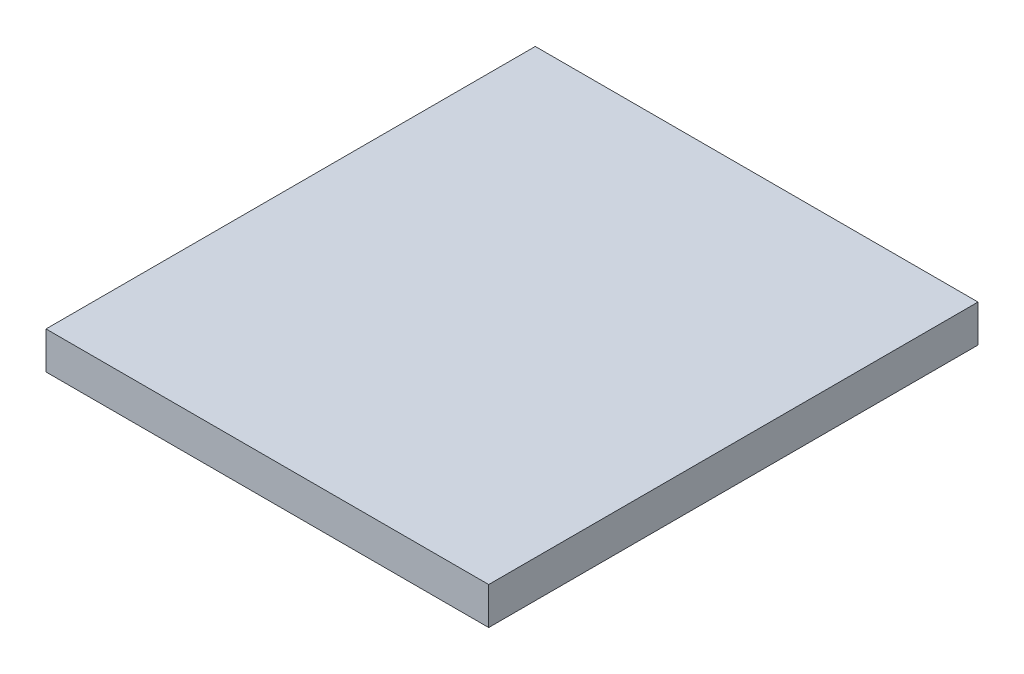
ISO-10303-21;
HEADER;
FILE_DESCRIPTION(('STEP AP214'),'2;1');
FILE_NAME('part.step','',(''),(''),'','','');
FILE_SCHEMA(('AUTOMOTIVE_DESIGN { 1 0 10303 214 1 1 1 1 }'));
ENDSEC;
DATA;
#1=APPLICATION_CONTEXT('core data for automotive mechanical design processes');
#2=APPLICATION_PROTOCOL_DEFINITION('international standard','automotive_design',2000,#1);
#3=PRODUCT_CONTEXT('',#1,'mechanical');
#4=PRODUCT('Part','Part','',(#3));
#5=PRODUCT_RELATED_PRODUCT_CATEGORY('part','',(#4));
#6=PRODUCT_DEFINITION_FORMATION('','',#4);
#7=PRODUCT_DEFINITION_CONTEXT('part definition',#1,'design');
#8=PRODUCT_DEFINITION('design','',#6,#7);
#9=PRODUCT_DEFINITION_SHAPE('','',#8);
#10=(LENGTH_UNIT() NAMED_UNIT(*) SI_UNIT(.MILLI.,.METRE.));
#11=(NAMED_UNIT(*) PLANE_ANGLE_UNIT() SI_UNIT($,.RADIAN.));
#12=(NAMED_UNIT(*) SI_UNIT($,.STERADIAN.) SOLID_ANGLE_UNIT());
#13=UNCERTAINTY_MEASURE_WITH_UNIT(LENGTH_MEASURE(1.E-05),#10,'distance_accuracy_value','');
#14=(GEOMETRIC_REPRESENTATION_CONTEXT(3) GLOBAL_UNCERTAINTY_ASSIGNED_CONTEXT((#13)) GLOBAL_UNIT_ASSIGNED_CONTEXT((#10,
#11,#12)) REPRESENTATION_CONTEXT('',''));
#15=CARTESIAN_POINT('',(0.,0.,0.));
#16=DIRECTION('',(0.,0.,1.));
#17=DIRECTION('',(1.,0.,0.));
#18=AXIS2_PLACEMENT_3D('',#15,#16,#17);
#19=CARTESIAN_POINT('',(0.,1.6,0.));
#20=DIRECTION('',(-1.,0.,0.));
#21=DIRECTION('',(0.,0.,1.));
#22=AXIS2_PLACEMENT_3D('',#19,#20,#21);
#23=PLANE('',#22);
#24=DIRECTION('',(0.,0.,-1.));
#25=VECTOR('',#24,1.);
#26=CARTESIAN_POINT('',(0.,0.,0.));
#27=LINE('',#26,#25);
#28=CARTESIAN_POINT('',(0.,0.,0.));
#29=VERTEX_POINT('',#28);
#30=CARTESIAN_POINT('',(0.,0.,-21.));
#31=VERTEX_POINT('',#30);
#32=EDGE_CURVE('E98',#29,#31,#27,.T.);
#33=ORIENTED_EDGE('',*,*,#32,.T.);
#34=DIRECTION('',(0.,-1.,0.));
#35=VECTOR('',#34,1.);
#36=CARTESIAN_POINT('',(0.,1.6,-21.));
#37=LINE('',#36,#35);
#38=CARTESIAN_POINT('',(0.,1.6,-21.));
#39=VERTEX_POINT('',#38);
#40=EDGE_CURVE('E11',#39,#31,#37,.T.);
#41=ORIENTED_EDGE('',*,*,#40,.F.);
#42=DIRECTION('',(0.,0.,-1.));
#43=VECTOR('',#42,1.);
#44=CARTESIAN_POINT('',(0.,1.6,0.));
#45=LINE('',#44,#43);
#46=CARTESIAN_POINT('',(0.,1.6,0.));
#47=VERTEX_POINT('',#46);
#48=EDGE_CURVE('E86',#47,#39,#45,.T.);
#49=ORIENTED_EDGE('',*,*,#48,.F.);
#50=DIRECTION('',(0.,-1.,0.));
#51=VECTOR('',#50,1.);
#52=CARTESIAN_POINT('',(0.,1.6,0.));
#53=LINE('',#52,#51);
#54=EDGE_CURVE('E94',#47,#29,#53,.T.);
#55=ORIENTED_EDGE('',*,*,#54,.T.);
#56=EDGE_LOOP('',(#33,#41,#49,#55));
#57=FACE_BOUND('',#56,.T.);
#58=ADVANCED_FACE('F35',(#57),#23,.F.);
#59=CARTESIAN_POINT('',(0.,1.6,-21.));
#60=DIRECTION('',(0.,0.,1.));
#61=DIRECTION('',(1.,0.,0.));
#62=AXIS2_PLACEMENT_3D('',#59,#60,#61);
#63=PLANE('',#62);
#64=DIRECTION('',(-1.,0.,0.));
#65=VECTOR('',#64,1.);
#66=CARTESIAN_POINT('',(0.,0.,-21.));
#67=LINE('',#66,#65);
#68=CARTESIAN_POINT('',(-19.,0.,-21.));
#69=VERTEX_POINT('',#68);
#70=EDGE_CURVE('E90',#31,#69,#67,.T.);
#71=ORIENTED_EDGE('',*,*,#70,.T.);
#72=DIRECTION('',(0.,-1.,0.));
#73=VECTOR('',#72,1.);
#74=CARTESIAN_POINT('',(-19.,1.6,-21.));
#75=LINE('',#74,#73);
#76=CARTESIAN_POINT('',(-19.,1.6,-21.));
#77=VERTEX_POINT('',#76);
#78=EDGE_CURVE('E43',#77,#69,#75,.T.);
#79=ORIENTED_EDGE('',*,*,#78,.F.);
#80=DIRECTION('',(-1.,0.,0.));
#81=VECTOR('',#80,1.);
#82=CARTESIAN_POINT('',(0.,1.6,-21.));
#83=LINE('',#82,#81);
#84=EDGE_CURVE('E81',#39,#77,#83,.T.);
#85=ORIENTED_EDGE('',*,*,#84,.F.);
#86=ORIENTED_EDGE('',*,*,#40,.T.);
#87=EDGE_LOOP('',(#71,#79,#85,#86));
#88=FACE_BOUND('',#87,.T.);
#89=ADVANCED_FACE('F89',(#88),#63,.F.);
#90=CARTESIAN_POINT('',(-19.,1.6,0.));
#91=DIRECTION('',(1.,0.,0.));
#92=DIRECTION('',(0.,0.,-1.));
#93=AXIS2_PLACEMENT_3D('',#90,#91,#92);
#94=PLANE('',#93);
#95=DIRECTION('',(0.,0.,1.));
#96=VECTOR('',#95,1.);
#97=CARTESIAN_POINT('',(-19.,0.,0.));
#98=LINE('',#97,#96);
#99=CARTESIAN_POINT('',(-19.,0.,0.));
#100=VERTEX_POINT('',#99);
#101=EDGE_CURVE('E68',#69,#100,#98,.T.);
#102=ORIENTED_EDGE('',*,*,#101,.T.);
#103=DIRECTION('',(0.,-1.,0.));
#104=VECTOR('',#103,1.);
#105=CARTESIAN_POINT('',(-19.,1.6,0.));
#106=LINE('',#105,#104);
#107=CARTESIAN_POINT('',(-19.,1.6,0.));
#108=VERTEX_POINT('',#107);
#109=EDGE_CURVE('E91',#108,#100,#106,.T.);
#110=ORIENTED_EDGE('',*,*,#109,.F.);
#111=DIRECTION('',(0.,0.,1.));
#112=VECTOR('',#111,1.);
#113=CARTESIAN_POINT('',(-19.,1.6,0.));
#114=LINE('',#113,#112);
#115=EDGE_CURVE('E84',#77,#108,#114,.T.);
#116=ORIENTED_EDGE('',*,*,#115,.F.);
#117=ORIENTED_EDGE('',*,*,#78,.T.);
#118=EDGE_LOOP('',(#102,#110,#116,#117));
#119=FACE_BOUND('',#118,.T.);
#120=ADVANCED_FACE('F92',(#119),#94,.F.);
#121=CARTESIAN_POINT('',(0.,1.6,0.));
#122=DIRECTION('',(0.,0.,-1.));
#123=DIRECTION('',(-1.,0.,0.));
#124=AXIS2_PLACEMENT_3D('',#121,#122,#123);
#125=PLANE('',#124);
#126=DIRECTION('',(1.,0.,0.));
#127=VECTOR('',#126,1.);
#128=CARTESIAN_POINT('',(0.,0.,0.));
#129=LINE('',#128,#127);
#130=EDGE_CURVE('E74',#100,#29,#129,.T.);
#131=ORIENTED_EDGE('',*,*,#130,.T.);
#132=ORIENTED_EDGE('',*,*,#54,.F.);
#133=DIRECTION('',(1.,0.,0.));
#134=VECTOR('',#133,1.);
#135=CARTESIAN_POINT('',(0.,1.6,0.));
#136=LINE('',#135,#134);
#137=EDGE_CURVE('E51',#108,#47,#136,.T.);
#138=ORIENTED_EDGE('',*,*,#137,.F.);
#139=ORIENTED_EDGE('',*,*,#109,.T.);
#140=EDGE_LOOP('',(#131,#132,#138,#139));
#141=FACE_BOUND('',#140,.T.);
#142=ADVANCED_FACE('F105',(#141),#125,.F.);
#143=CARTESIAN_POINT('',(0.,1.6,0.));
#144=DIRECTION('',(0.,1.,0.));
#145=DIRECTION('',(0.,0.,1.));
#146=AXIS2_PLACEMENT_3D('',#143,#144,#145);
#147=PLANE('',#146);
#148=ORIENTED_EDGE('',*,*,#48,.T.);
#149=ORIENTED_EDGE('',*,*,#84,.T.);
#150=ORIENTED_EDGE('',*,*,#115,.T.);
#151=ORIENTED_EDGE('',*,*,#137,.T.);
#152=EDGE_LOOP('',(#148,#149,#150,#151));
#153=FACE_BOUND('',#152,.T.);
#154=ADVANCED_FACE('F82',(#153),#147,.T.);
#155=CARTESIAN_POINT('',(0.,0.,0.));
#156=DIRECTION('',(0.,1.,0.));
#157=DIRECTION('',(0.,0.,1.));
#158=AXIS2_PLACEMENT_3D('',#155,#156,#157);
#159=PLANE('',#158);
#160=ORIENTED_EDGE('',*,*,#32,.F.);
#161=ORIENTED_EDGE('',*,*,#130,.F.);
#162=ORIENTED_EDGE('',*,*,#101,.F.);
#163=ORIENTED_EDGE('',*,*,#70,.F.);
#164=EDGE_LOOP('',(#160,#161,#162,#163));
#165=FACE_BOUND('',#164,.T.);
#166=ADVANCED_FACE('F108',(#165),#159,.F.);
#167=CLOSED_SHELL('',(#58,#89,#120,#142,#154,#166));
#168=MANIFOLD_SOLID_BREP('B2',#167);
#169=ADVANCED_BREP_SHAPE_REPRESENTATION('',(#18,#168),#14);
#170=SHAPE_DEFINITION_REPRESENTATION(#9,#169);
ENDSEC;
END-ISO-10303-21;
